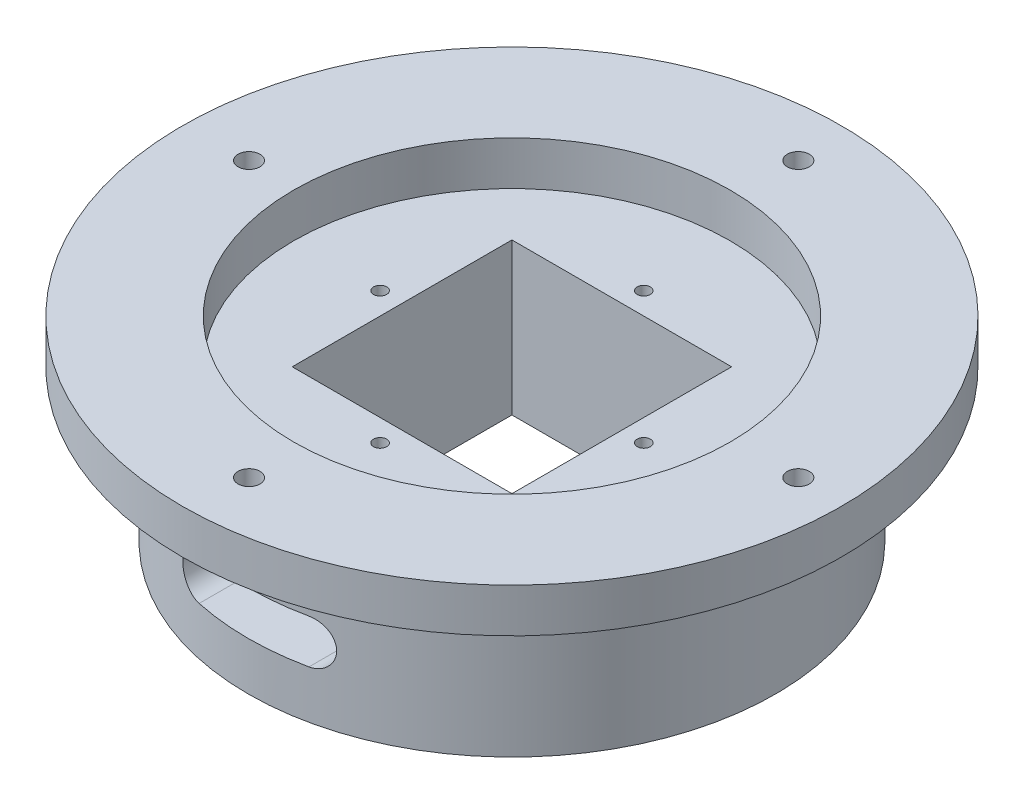
ISO-10303-21;
HEADER;
FILE_DESCRIPTION(('STEP AP214'),'2;1');
FILE_NAME('part.step','',(''),(''),'','','');
FILE_SCHEMA(('AUTOMOTIVE_DESIGN { 1 0 10303 214 1 1 1 1 }'));
ENDSEC;
DATA;
#1=APPLICATION_CONTEXT('core data for automotive mechanical design processes');
#2=APPLICATION_PROTOCOL_DEFINITION('international standard','automotive_design',2000,#1);
#3=PRODUCT_CONTEXT('',#1,'mechanical');
#4=PRODUCT('Part','Part','',(#3));
#5=PRODUCT_RELATED_PRODUCT_CATEGORY('part','',(#4));
#6=PRODUCT_DEFINITION_FORMATION('','',#4);
#7=PRODUCT_DEFINITION_CONTEXT('part definition',#1,'design');
#8=PRODUCT_DEFINITION('design','',#6,#7);
#9=PRODUCT_DEFINITION_SHAPE('','',#8);
#10=(LENGTH_UNIT() NAMED_UNIT(*) SI_UNIT(.MILLI.,.METRE.));
#11=(NAMED_UNIT(*) PLANE_ANGLE_UNIT() SI_UNIT($,.RADIAN.));
#12=(NAMED_UNIT(*) SI_UNIT($,.STERADIAN.) SOLID_ANGLE_UNIT());
#13=UNCERTAINTY_MEASURE_WITH_UNIT(LENGTH_MEASURE(1.E-05),#10,'distance_accuracy_value','');
#14=(GEOMETRIC_REPRESENTATION_CONTEXT(3) GLOBAL_UNCERTAINTY_ASSIGNED_CONTEXT((#13)) GLOBAL_UNIT_ASSIGNED_CONTEXT((#10,
#11,#12)) REPRESENTATION_CONTEXT('',''));
#15=CARTESIAN_POINT('',(0.,0.,0.));
#16=DIRECTION('',(0.,0.,1.));
#17=DIRECTION('',(1.,0.,0.));
#18=AXIS2_PLACEMENT_3D('',#15,#16,#17);
#19=CARTESIAN_POINT('',(-30.6560967692802,69.,61.474017121987));
#20=DIRECTION('',(0.,-1.,0.));
#21=DIRECTION('',(0.,0.,-1.));
#22=AXIS2_PLACEMENT_3D('',#19,#20,#21);
#23=CYLINDRICAL_SURFACE('',#22,3.);
#24=CARTESIAN_POINT('',(-30.6560967692802,21.8993662967322,61.474017121987));
#25=DIRECTION('',(0.,-1.,0.));
#26=DIRECTION('',(1.,0.,0.));
#27=AXIS2_PLACEMENT_3D('',#24,#25,#26);
#28=CIRCLE('',#27,3.);
#29=CARTESIAN_POINT('',(-27.6560967692802,21.8993662967322,61.474017121987));
#30=VERTEX_POINT('',#29);
#31=EDGE_CURVE('E140',#30,#30,#28,.T.);
#32=ORIENTED_EDGE('',*,*,#31,.F.);
#33=EDGE_LOOP('',(#32));
#34=FACE_BOUND('',#33,.T.);
#35=CARTESIAN_POINT('',(-30.6560967692802,0.,61.474017121987));
#36=DIRECTION('',(0.,1.,0.));
#37=DIRECTION('',(0.,0.,1.));
#38=AXIS2_PLACEMENT_3D('',#35,#36,#37);
#39=CIRCLE('',#38,3.);
#40=CARTESIAN_POINT('',(-30.6560967692802,0.,64.474017121987));
#41=VERTEX_POINT('',#40);
#42=EDGE_CURVE('E211',#41,#41,#39,.T.);
#43=ORIENTED_EDGE('',*,*,#42,.F.);
#44=EDGE_LOOP('',(#43));
#45=FACE_BOUND('',#44,.T.);
#46=ADVANCED_FACE('F39',(#34,#45),#23,.F.);
#47=CARTESIAN_POINT('',(0.,69.,0.));
#48=DIRECTION('',(0.,1.,0.));
#49=DIRECTION('',(0.,0.,1.));
#50=AXIS2_PLACEMENT_3D('',#47,#48,#49);
#51=PLANE('',#50);
#52=DIRECTION('',(1.,0.,0.));
#53=VECTOR('',#52,1.);
#54=CARTESIAN_POINT('',(0.,69.,-48.525982878013));
#55=LINE('',#54,#53);
#56=CARTESIAN_POINT('',(-80.6560967692802,69.,-48.525982878013));
#57=VERTEX_POINT('',#56);
#58=CARTESIAN_POINT('',(19.3439032307198,69.,-48.525982878013));
#59=VERTEX_POINT('',#58);
#60=EDGE_CURVE('E194',#57,#59,#55,.T.);
#61=ORIENTED_EDGE('',*,*,#60,.T.);
#62=DIRECTION('',(0.,0.,1.));
#63=VECTOR('',#62,1.);
#64=CARTESIAN_POINT('',(19.3439032307198,69.,0.));
#65=LINE('',#64,#63);
#66=CARTESIAN_POINT('',(19.3439032307198,69.,51.474017121987));
#67=VERTEX_POINT('',#66);
#68=EDGE_CURVE('E197',#59,#67,#65,.T.);
#69=ORIENTED_EDGE('',*,*,#68,.T.);
#70=DIRECTION('',(1.,0.,0.));
#71=VECTOR('',#70,1.);
#72=CARTESIAN_POINT('',(0.,69.,51.474017121987));
#73=LINE('',#72,#71);
#74=CARTESIAN_POINT('',(-80.6560967692802,69.,51.474017121987));
#75=VERTEX_POINT('',#74);
#76=EDGE_CURVE('E199',#75,#67,#73,.T.);
#77=ORIENTED_EDGE('',*,*,#76,.F.);
#78=DIRECTION('',(0.,0.,1.));
#79=VECTOR('',#78,1.);
#80=CARTESIAN_POINT('',(-80.6560967692802,69.,0.));
#81=LINE('',#80,#79);
#82=EDGE_CURVE('E202',#57,#75,#81,.T.);
#83=ORIENTED_EDGE('',*,*,#82,.F.);
#84=EDGE_LOOP('',(#61,#69,#77,#83));
#85=FACE_BOUND('',#84,.T.);
#86=CARTESIAN_POINT('',(-90.6560967692802,69.,1.47401712198698));
#87=DIRECTION('',(0.,1.,0.));
#88=DIRECTION('',(0.,0.,1.));
#89=AXIS2_PLACEMENT_3D('',#86,#87,#88);
#90=CIRCLE('',#89,3.00000000000001);
#91=CARTESIAN_POINT('',(-90.6560967692802,69.,4.47401712198698));
#92=VERTEX_POINT('',#91);
#93=EDGE_CURVE('E188',#92,#92,#90,.T.);
#94=ORIENTED_EDGE('',*,*,#93,.F.);
#95=EDGE_LOOP('',(#94));
#96=FACE_BOUND('',#95,.T.);
#97=CARTESIAN_POINT('',(-30.6560967692802,69.,61.474017121987));
#98=DIRECTION('',(0.,1.,0.));
#99=DIRECTION('',(0.,0.,1.));
#100=AXIS2_PLACEMENT_3D('',#97,#98,#99);
#101=CIRCLE('',#100,3.);
#102=CARTESIAN_POINT('',(-30.6560967692802,69.,64.474017121987));
#103=VERTEX_POINT('',#102);
#104=EDGE_CURVE('E185',#103,#103,#101,.T.);
#105=ORIENTED_EDGE('',*,*,#104,.F.);
#106=EDGE_LOOP('',(#105));
#107=FACE_BOUND('',#106,.T.);
#108=CARTESIAN_POINT('',(-30.6560967692802,69.,-58.525982878013));
#109=DIRECTION('',(0.,1.,0.));
#110=DIRECTION('',(0.,0.,1.));
#111=AXIS2_PLACEMENT_3D('',#108,#109,#110);
#112=CIRCLE('',#111,3.);
#113=CARTESIAN_POINT('',(-30.6560967692802,69.,-55.525982878013));
#114=VERTEX_POINT('',#113);
#115=EDGE_CURVE('E181',#114,#114,#112,.T.);
#116=ORIENTED_EDGE('',*,*,#115,.F.);
#117=EDGE_LOOP('',(#116));
#118=FACE_BOUND('',#117,.T.);
#119=CARTESIAN_POINT('',(29.3439032307198,69.,1.47401712198698));
#120=DIRECTION('',(0.,1.,0.));
#121=DIRECTION('',(0.,0.,1.));
#122=AXIS2_PLACEMENT_3D('',#119,#120,#121);
#123=CIRCLE('',#122,3.);
#124=CARTESIAN_POINT('',(29.3439032307198,69.,4.47401712198698));
#125=VERTEX_POINT('',#124);
#126=EDGE_CURVE('E178',#125,#125,#123,.T.);
#127=ORIENTED_EDGE('',*,*,#126,.F.);
#128=EDGE_LOOP('',(#127));
#129=FACE_BOUND('',#128,.T.);
#130=CARTESIAN_POINT('',(-30.6560967692802,69.,1.47401712198698));
#131=DIRECTION('',(0.,1.,0.));
#132=DIRECTION('',(0.,0.,1.));
#133=AXIS2_PLACEMENT_3D('',#130,#131,#132);
#134=CIRCLE('',#133,99.33727817983);
#135=CARTESIAN_POINT('',(-30.6560967692802,69.,100.811295301817));
#136=VERTEX_POINT('',#135);
#137=EDGE_CURVE('E239',#136,#136,#134,.F.);
#138=ORIENTED_EDGE('',*,*,#137,.F.);
#139=EDGE_LOOP('',(#138));
#140=FACE_BOUND('',#139,.T.);
#141=ADVANCED_FACE('F314',(#85,#96,#107,#118,#129,#140),#51,.T.);
#142=CARTESIAN_POINT('',(0.,69.,-48.525982878013));
#143=DIRECTION('',(0.,0.,-1.));
#144=DIRECTION('',(-1.,0.,0.));
#145=AXIS2_PLACEMENT_3D('',#142,#143,#144);
#146=PLANE('',#145);
#147=DIRECTION('',(1.,0.,0.));
#148=VECTOR('',#147,1.);
#149=CARTESIAN_POINT('',(0.,0.,-48.525982878013));
#150=LINE('',#149,#148);
#151=CARTESIAN_POINT('',(-80.6560967692802,0.,-48.525982878013));
#152=VERTEX_POINT('',#151);
#153=CARTESIAN_POINT('',(19.3439032307198,0.,-48.525982878013));
#154=VERTEX_POINT('',#153);
#155=EDGE_CURVE('E220',#152,#154,#150,.T.);
#156=ORIENTED_EDGE('',*,*,#155,.T.);
#157=DIRECTION('',(0.,-1.,0.));
#158=VECTOR('',#157,1.);
#159=CARTESIAN_POINT('',(19.3439032307198,69.,-48.525982878013));
#160=LINE('',#159,#158);
#161=EDGE_CURVE('E236',#59,#154,#160,.T.);
#162=ORIENTED_EDGE('',*,*,#161,.F.);
#163=ORIENTED_EDGE('',*,*,#60,.F.);
#164=DIRECTION('',(0.,-1.,0.));
#165=VECTOR('',#164,1.);
#166=CARTESIAN_POINT('',(-80.6560967692802,69.,-48.525982878013));
#167=LINE('',#166,#165);
#168=EDGE_CURVE('E205',#57,#152,#167,.T.);
#169=ORIENTED_EDGE('',*,*,#168,.T.);
#170=EDGE_LOOP('',(#156,#162,#163,#169));
#171=FACE_BOUND('',#170,.T.);
#172=ADVANCED_FACE('F317',(#171),#146,.F.);
#173=CARTESIAN_POINT('',(19.3439032307198,69.,0.));
#174=DIRECTION('',(1.,0.,0.));
#175=DIRECTION('',(0.,0.,-1.));
#176=AXIS2_PLACEMENT_3D('',#173,#174,#175);
#177=PLANE('',#176);
#178=DIRECTION('',(0.,0.,1.));
#179=VECTOR('',#178,1.);
#180=CARTESIAN_POINT('',(19.3439032307198,0.,0.));
#181=LINE('',#180,#179);
#182=CARTESIAN_POINT('',(19.3439032307198,0.,51.474017121987));
#183=VERTEX_POINT('',#182);
#184=EDGE_CURVE('E223',#154,#183,#181,.T.);
#185=ORIENTED_EDGE('',*,*,#184,.T.);
#186=DIRECTION('',(0.,-1.,0.));
#187=VECTOR('',#186,1.);
#188=CARTESIAN_POINT('',(19.3439032307198,69.,51.474017121987));
#189=LINE('',#188,#187);
#190=EDGE_CURVE('E234',#67,#183,#189,.T.);
#191=ORIENTED_EDGE('',*,*,#190,.F.);
#192=ORIENTED_EDGE('',*,*,#68,.F.);
#193=ORIENTED_EDGE('',*,*,#161,.T.);
#194=EDGE_LOOP('',(#185,#191,#192,#193));
#195=FACE_BOUND('',#194,.T.);
#196=ADVANCED_FACE('F328',(#195),#177,.F.);
#197=CARTESIAN_POINT('',(0.,69.,51.474017121987));
#198=DIRECTION('',(0.,0.,-1.));
#199=DIRECTION('',(-1.,0.,0.));
#200=AXIS2_PLACEMENT_3D('',#197,#198,#199);
#201=PLANE('',#200);
#202=CARTESIAN_POINT('',(-55.6560967692802,31.8993662967322,51.474017121987));
#203=DIRECTION('',(0.,0.,-1.));
#204=DIRECTION('',(-1.,0.,0.));
#205=AXIS2_PLACEMENT_3D('',#202,#203,#204);
#206=CIRCLE('',#205,9.99999999999999);
#207=CARTESIAN_POINT('',(-55.6560967692802,21.8993662967322,51.474017121987));
#208=VERTEX_POINT('',#207);
#209=CARTESIAN_POINT('',(-55.6560967692802,41.8993662967322,51.474017121987));
#210=VERTEX_POINT('',#209);
#211=EDGE_CURVE('E60',#208,#210,#206,.T.);
#212=ORIENTED_EDGE('',*,*,#211,.F.);
#213=DIRECTION('',(-1.,0.,0.));
#214=VECTOR('',#213,1.);
#215=CARTESIAN_POINT('',(-55.6560967692802,21.8993662967322,51.474017121987));
#216=LINE('',#215,#214);
#217=CARTESIAN_POINT('',(-5.65619666327777,21.8993662967322,51.474017121987));
#218=VERTEX_POINT('',#217);
#219=EDGE_CURVE('E128',#218,#208,#216,.T.);
#220=ORIENTED_EDGE('',*,*,#219,.F.);
#221=CARTESIAN_POINT('',(-5.65619666327777,31.8993662967322,51.474017121987));
#222=DIRECTION('',(0.,0.,-1.));
#223=DIRECTION('',(-1.,0.,0.));
#224=AXIS2_PLACEMENT_3D('',#221,#222,#223);
#225=CIRCLE('',#224,9.99999999999999);
#226=CARTESIAN_POINT('',(-5.65619666327777,41.8993662967322,51.474017121987));
#227=VERTEX_POINT('',#226);
#228=EDGE_CURVE('E113',#227,#218,#225,.T.);
#229=ORIENTED_EDGE('',*,*,#228,.F.);
#230=DIRECTION('',(1.,0.,0.));
#231=VECTOR('',#230,1.);
#232=CARTESIAN_POINT('',(-55.6560967692802,41.8993662967322,51.474017121987));
#233=LINE('',#232,#231);
#234=EDGE_CURVE('E121',#210,#227,#233,.T.);
#235=ORIENTED_EDGE('',*,*,#234,.F.);
#236=EDGE_LOOP('',(#212,#220,#229,#235));
#237=FACE_BOUND('',#236,.T.);
#238=DIRECTION('',(1.,0.,0.));
#239=VECTOR('',#238,1.);
#240=CARTESIAN_POINT('',(0.,0.,51.474017121987));
#241=LINE('',#240,#239);
#242=CARTESIAN_POINT('',(-80.6560967692802,0.,51.474017121987));
#243=VERTEX_POINT('',#242);
#244=EDGE_CURVE('E226',#243,#183,#241,.T.);
#245=ORIENTED_EDGE('',*,*,#244,.F.);
#246=DIRECTION('',(0.,-1.,0.));
#247=VECTOR('',#246,1.);
#248=CARTESIAN_POINT('',(-80.6560967692802,69.,51.474017121987));
#249=LINE('',#248,#247);
#250=EDGE_CURVE('E232',#75,#243,#249,.T.);
#251=ORIENTED_EDGE('',*,*,#250,.F.);
#252=ORIENTED_EDGE('',*,*,#76,.T.);
#253=ORIENTED_EDGE('',*,*,#190,.T.);
#254=EDGE_LOOP('',(#245,#251,#252,#253));
#255=FACE_BOUND('',#254,.T.);
#256=ADVANCED_FACE('F125',(#237,#255),#201,.T.);
#257=CARTESIAN_POINT('',(-30.6560967692802,69.,1.47401712198698));
#258=DIRECTION('',(0.,-1.,0.));
#259=DIRECTION('',(0.,0.,-1.));
#260=AXIS2_PLACEMENT_3D('',#257,#258,#259);
#261=CYLINDRICAL_SURFACE('',#260,120.);
#262=CARTESIAN_POINT('',(-30.6560967692802,21.8993662967322,1.47401712198698));
#263=DIRECTION('',(0.,-1.,0.));
#264=DIRECTION('',(1.,0.,0.));
#265=AXIS2_PLACEMENT_3D('',#262,#263,#264);
#266=CIRCLE('',#265,120.);
#267=CARTESIAN_POINT('',(-5.65619666327777,21.8993662967322,118.840984343134));
#268=VERTEX_POINT('',#267);
#269=CARTESIAN_POINT('',(-55.6560967692802,21.8993662967322,118.840963065042));
#270=VERTEX_POINT('',#269);
#271=EDGE_CURVE('E141',#268,#270,#266,.T.);
#272=ORIENTED_EDGE('',*,*,#271,.T.);
#273=CARTESIAN_POINT('',(-55.6560967692802,21.8993662967322,118.840963065042));
#274=CARTESIAN_POINT('',(-55.9447800015794,21.8993396281902,118.779482635862));
#275=CARTESIAN_POINT('',(-56.2332187693566,21.9118656376083,118.716918926815));
#276=CARTESIAN_POINT('',(-56.8075549357816,21.9617067146833,118.590143293644));
#277=CARTESIAN_POINT('',(-57.0934525697199,21.9990194625186,118.525931524305));
#278=CARTESIAN_POINT('',(-57.6605725500231,22.0980940262476,118.396397540875));
#279=CARTESIAN_POINT('',(-57.9417970765762,22.1598440873035,118.331075875104));
#280=CARTESIAN_POINT('',(-58.4977577795511,22.3073038344603,118.199864494647));
#281=CARTESIAN_POINT('',(-58.7724939212498,22.3930136487524,118.133974776924));
#282=CARTESIAN_POINT('',(-59.3136350237975,22.5878072881324,118.002224386443));
#283=CARTESIAN_POINT('',(-59.5800380147538,22.6968965928097,117.936363724128));
#284=CARTESIAN_POINT('',(-60.1025977443109,22.9377038432077,117.805337690982));
#285=CARTESIAN_POINT('',(-60.3587543069524,23.0694221773254,117.740172332105));
#286=CARTESIAN_POINT('',(-60.8589834895232,23.354610621085,117.611230579361));
#287=CARTESIAN_POINT('',(-61.1030576333196,23.5080779782023,117.547454010907));
#288=CARTESIAN_POINT('',(-61.5774051402999,23.8357934915934,117.421992027526));
#289=CARTESIAN_POINT('',(-61.8076785796895,24.0100415331032,117.360306601053));
#290=CARTESIAN_POINT('',(-62.2524930264922,24.3780111505835,117.239818607927));
#291=CARTESIAN_POINT('',(-62.4670502936197,24.5717120943418,117.181013083266));
#292=CARTESIAN_POINT('',(-62.8790502855517,24.9774782897764,117.066953605841));
#293=CARTESIAN_POINT('',(-63.0764938611294,25.1895426275042,117.011699476562));
#294=CARTESIAN_POINT('',(-63.452713873985,25.6306507976631,116.905469197397));
#295=CARTESIAN_POINT('',(-63.631489412642,25.8596954465667,116.854493253472));
#296=CARTESIAN_POINT('',(-63.9688660371863,26.3331859694662,116.757538160469));
#297=CARTESIAN_POINT('',(-64.1274676819418,26.5776314165403,116.711558872976));
#298=CARTESIAN_POINT('',(-64.4190874277434,27.0733504942292,116.626450502282));
#299=CARTESIAN_POINT('',(-64.5526838456489,27.324257803681,116.587169166164));
#300=CARTESIAN_POINT('',(-64.7983096988317,27.8372475526085,116.51455654018));
#301=CARTESIAN_POINT('',(-64.910339451668,28.0993298274688,116.481225162705));
#302=CARTESIAN_POINT('',(-65.1117858855593,28.6326883883606,116.421033378666));
#303=CARTESIAN_POINT('',(-65.2012086286786,28.9039621875139,116.39417123747));
#304=CARTESIAN_POINT('',(-65.3566326316257,29.453718690425,116.34733608962));
#305=CARTESIAN_POINT('',(-65.4226346297823,29.7322011666352,116.327362865796));
#306=CARTESIAN_POINT('',(-65.5284349586385,30.2830574038422,116.295282399363));
#307=CARTESIAN_POINT('',(-65.5691685008332,30.5552355673586,116.282894671162));
#308=CARTESIAN_POINT('',(-65.6280705325789,31.1022437323558,116.264966263044));
#309=CARTESIAN_POINT('',(-65.6462396612338,31.3770736585071,116.2594253892));
#310=CARTESIAN_POINT('',(-65.6598435537618,31.9273153225644,116.25527762));
#311=CARTESIAN_POINT('',(-65.6552809379798,32.2027269897532,116.256669925439));
#312=CARTESIAN_POINT('',(-65.6234699999719,32.7521135644313,116.266364799168));
#313=CARTESIAN_POINT('',(-65.5962218389448,33.0260884821159,116.274667318355));
#314=CARTESIAN_POINT('',(-65.5201227341005,33.5647108360612,116.297800511205));
#315=CARTESIAN_POINT('',(-65.4717492552519,33.8294321240456,116.312486867854));
#316=CARTESIAN_POINT('',(-65.3539510711577,34.3537106738368,116.348133827228));
#317=CARTESIAN_POINT('',(-65.2845267641057,34.6132680332245,116.369094311273));
#318=CARTESIAN_POINT('',(-65.125217371741,35.1254612929868,116.416988353646));
#319=CARTESIAN_POINT('',(-65.0353318334324,35.3780970399835,116.443922044215));
#320=CARTESIAN_POINT('',(-64.835842726376,35.8747769160433,116.503386375417));
#321=CARTESIAN_POINT('',(-64.7262388265928,36.1188209007841,116.535917110015));
#322=CARTESIAN_POINT('',(-64.4865862190323,36.599967997945,116.606609343247));
#323=CARTESIAN_POINT('',(-64.3562828451307,36.8369339846129,116.644840557871));
#324=CARTESIAN_POINT('',(-64.0772909410883,37.2990293031471,116.726109893783));
#325=CARTESIAN_POINT('',(-63.9285957313515,37.5241542920119,116.769149760939));
#326=CARTESIAN_POINT('',(-63.6139898190157,37.9610822758911,116.859475721824));
#327=CARTESIAN_POINT('',(-63.4480812311172,38.1728869022179,116.906761293864));
#328=CARTESIAN_POINT('',(-63.1002133208704,38.5819726553262,117.005017127788));
#329=CARTESIAN_POINT('',(-62.9182530752277,38.7792529454662,117.055987601597));
#330=CARTESIAN_POINT('',(-62.5325572207623,39.1651366910612,117.162965462358));
#331=CARTESIAN_POINT('',(-62.3282665839145,39.3531533627085,117.219089198707));
#332=CARTESIAN_POINT('',(-61.9052197403998,39.7112332535957,117.334020365672));
#333=CARTESIAN_POINT('',(-61.6864632135215,39.8812960751996,117.392827855687));
#334=CARTESIAN_POINT('',(-61.2358695120488,40.202542231008,117.512510108967));
#335=CARTESIAN_POINT('',(-61.0040260443978,40.3537163680668,117.57338586109));
#336=CARTESIAN_POINT('',(-60.5288969614164,40.6361967886175,117.696545203727));
#337=CARTESIAN_POINT('',(-60.2856113136995,40.7675030158699,117.758828798225));
#338=CARTESIAN_POINT('',(-59.780637962665,41.0136264697052,117.886349843128));
#339=CARTESIAN_POINT('',(-59.5186051692103,41.1277217958464,117.951615238923));
#340=CARTESIAN_POINT('',(-58.9858785361321,41.3330300390394,118.082330088268));
#341=CARTESIAN_POINT('',(-58.715187716732,41.424250839454,118.147779470523));
#342=CARTESIAN_POINT('',(-58.1672102901161,41.5831470452101,118.278203144775));
#343=CARTESIAN_POINT('',(-57.8899311404574,41.6508478329123,118.343177874382));
#344=CARTESIAN_POINT('',(-57.3304939764186,41.7623112362124,118.472131908834));
#345=CARTESIAN_POINT('',(-57.0483384056829,41.8060855023376,118.53611168338));
#346=CARTESIAN_POINT('',(-56.5806950435025,41.8582526023575,118.640355183729));
#347=CARTESIAN_POINT('',(-56.3960600408767,41.8736722616354,118.681056411216));
#348=CARTESIAN_POINT('',(-56.0263533717192,41.8942218540471,118.761637525151));
#349=CARTESIAN_POINT('',(-55.8412828923095,41.8993683682432,118.801518632133));
#350=CARTESIAN_POINT('',(-55.6560967692802,41.8993662967322,118.840963065042));
#351=B_SPLINE_CURVE_WITH_KNOTS('',3,(#273,#274,#275,#276,#277,#278,#279,#280,#281,#282,#283,
#284,#285,#286,#287,#288,#289,#290,#291,#292,#293,#294,#295,#296,#297,#298,#299,#300,#301,#302,
#303,#304,#305,#306,#307,#308,#309,#310,#311,#312,#313,#314,#315,#316,#317,#318,#319,#320,#321,
#322,#323,#324,#325,#326,#327,#328,#329,#330,#331,#332,#333,#334,#335,#336,#337,#338,#339,#340,
#341,#342,#343,#344,#345,#346,#347,#348,#349,#350),.UNSPECIFIED.,.F.,.F.,(4,2,2,2,2,2,2,2,2,2,2,
2,2,2,2,2,2,2,2,2,2,2,2,2,2,2,2,2,2,2,2,2,2,2,2,2,2,2,4),(0.,0.885185155359751,1.77028747681313,
2.65496456278422,3.53964638210691,4.42453577674423,5.30944036084208,6.19423305255582,
7.07902085811487,7.96287995345002,8.84669508425896,9.73055273957238,10.6143859044516,
11.4741900489593,12.333981532291,13.1935422176141,14.0530758032539,14.8785289106434,
15.7039586377533,16.5292932177213,17.3546219330844,18.1621912350344,18.9697452621083,
19.777317169546,20.5849026359187,21.4033275634807,22.2220506064063,23.0406731862743,
23.8593428842089,24.7081506169768,25.5569771449241,26.4062153800897,27.2554560191209,
28.1338871174832,29.0120150603558,29.8891923784457,30.7659421917189,31.334768501888,
31.9026759702232),.UNSPECIFIED.);
#352=CARTESIAN_POINT('',(-55.6560967692802,41.8993662967322,118.840963065042));
#353=VERTEX_POINT('',#352);
#354=EDGE_CURVE('E11',#270,#353,#351,.T.);
#355=ORIENTED_EDGE('',*,*,#354,.T.);
#356=CARTESIAN_POINT('',(-30.6560967692802,41.8993662967322,1.47401712198698));
#357=DIRECTION('',(0.,1.,0.));
#358=DIRECTION('',(0.,0.,1.));
#359=AXIS2_PLACEMENT_3D('',#356,#357,#358);
#360=CIRCLE('',#359,120.);
#361=CARTESIAN_POINT('',(-5.65619666327777,41.8993662967322,118.840984343134));
#362=VERTEX_POINT('',#361);
#363=EDGE_CURVE('E138',#353,#362,#360,.T.);
#364=ORIENTED_EDGE('',*,*,#363,.T.);
#365=CARTESIAN_POINT('',(-5.65619666327777,41.8993662967322,118.840984343134));
#366=CARTESIAN_POINT('',(-5.3675134846331,41.8993929653078,118.779504182228));
#367=CARTESIAN_POINT('',(-5.07907476938728,41.8868669605033,118.716940742035));
#368=CARTESIAN_POINT('',(-4.50473870555798,41.8370259014586,118.590165645791));
#369=CARTESIAN_POINT('',(-4.21884112168412,41.7997131670397,118.525954144525));
#370=CARTESIAN_POINT('',(-3.65172123994061,41.7006386387809,118.396420694696));
#371=CARTESIAN_POINT('',(-3.37049676186575,41.6388885998733,118.331099294458));
#372=CARTESIAN_POINT('',(-2.81453615296406,41.4914289055501,118.199888440489));
#373=CARTESIAN_POINT('',(-2.53980005686012,41.4057191219443,118.133998983722));
#374=CARTESIAN_POINT('',(-1.99865904243445,41.210925552589,118.002249108709));
#375=CARTESIAN_POINT('',(-1.73225609400337,41.1018362872555,117.936388700905));
#376=CARTESIAN_POINT('',(-1.20969644599616,40.8610291244518,117.805363168293));
#377=CARTESIAN_POINT('',(-0.953539922380032,40.729310838583,117.740198055441));
#378=CARTESIAN_POINT('',(-0.453310813727186,40.4441225005801,117.611256784177));
#379=CARTESIAN_POINT('',(-0.209236704827462,40.290655200963,117.547480451181));
#380=CARTESIAN_POINT('',(0.265110737263208,39.9629398123004,117.42201892609));
#381=CARTESIAN_POINT('',(0.495384146658991,39.7886918380178,117.360333722449));
#382=CARTESIAN_POINT('',(0.94019855187831,39.4207223548385,117.239846156599));
#383=CARTESIAN_POINT('',(1.15475580655401,39.2270214770577,117.181040836553));
#384=CARTESIAN_POINT('',(1.56675577920231,38.8212554218447,117.066981751693));
#385=CARTESIAN_POINT('',(1.76419934794372,38.6091911583564,117.011727810365));
#386=CARTESIAN_POINT('',(2.1404193544244,38.1680831448975,116.905497888188));
#387=CARTESIAN_POINT('',(2.319194893527,37.9390385784403,116.854522113304));
#388=CARTESIAN_POINT('',(2.65657152792609,37.4655482284683,116.757567337243));
#389=CARTESIAN_POINT('',(2.81517318208585,37.2211028718716,116.711588197653));
#390=CARTESIAN_POINT('',(3.106792988713,36.7253839262106,116.626480086525));
#391=CARTESIAN_POINT('',(3.24038945328041,36.4744766552903,116.587198863869));
#392=CARTESIAN_POINT('',(3.4860154022913,35.9614869843294,116.514586443526));
#393=CARTESIAN_POINT('',(3.5980452042909,35.6994047489029,116.481255158228));
#394=CARTESIAN_POINT('',(3.79949174021826,35.1660462666962,116.421063535805));
#395=CARTESIAN_POINT('',(3.88891453617667,34.8947725067804,116.394201464062));
#396=CARTESIAN_POINT('',(4.04433864922759,34.3450160813583,116.347366431325));
#397=CARTESIAN_POINT('',(4.11034070464396,34.0665336433979,116.327393253164));
#398=CARTESIAN_POINT('',(4.21614116359994,33.5156774112076,116.295312848214));
#399=CARTESIAN_POINT('',(4.25687477289565,33.2434992133994,116.282925138451));
#400=CARTESIAN_POINT('',(4.31577693223774,32.6964909750367,116.264996747628));
#401=CARTESIAN_POINT('',(4.33394612138402,32.4216610098113,116.259455872642));
#402=CARTESIAN_POINT('',(4.34755012795305,31.871419262507,116.255308081618));
#403=CARTESIAN_POINT('',(4.34298756570685,31.5960075511454,116.256700366381));
#404=CARTESIAN_POINT('',(4.31117672724372,31.0466208830964,116.266395179551));
#405=CARTESIAN_POINT('',(4.28392861222516,30.7726459162138,116.274697658855));
#406=CARTESIAN_POINT('',(4.20782958628671,30.2340234323023,116.297830755569));
#407=CARTESIAN_POINT('',(4.15945613828092,29.9693020640013,116.312517057035));
#408=CARTESIAN_POINT('',(4.04165800275359,29.4450233503398,116.348163890259));
#409=CARTESIAN_POINT('',(3.97223371342379,29.185465907399,116.369124303336));
#410=CARTESIAN_POINT('',(3.81292434271271,28.6732724784598,116.417018188796));
#411=CARTESIAN_POINT('',(3.72303880833885,28.4206366458381,116.443951793418));
#412=CARTESIAN_POINT('',(3.52354969476163,27.9239565978016,116.503415938645));
#413=CARTESIAN_POINT('',(3.41394578452429,27.6799125267082,116.535946573214));
#414=CARTESIAN_POINT('',(3.17429315197278,27.1987652786062,116.606638588565));
#415=CARTESIAN_POINT('',(3.04398976509423,26.9617992264142,116.644869684679));
#416=CARTESIAN_POINT('',(2.76499782289952,26.4997037773145,116.726138770155));
#417=CARTESIAN_POINT('',(2.6163025879826,26.2745787234089,116.769178505381));
#418=CARTESIAN_POINT('',(2.30169661296626,25.8376506118256,116.859504190089));
#419=CARTESIAN_POINT('',(2.13578798757799,25.6258459228284,116.906789617881));
#420=CARTESIAN_POINT('',(1.7879199900869,25.2167600485223,117.005045152001));
#421=CARTESIAN_POINT('',(1.60595969469213,25.0194796998523,117.056015470252));
#422=CARTESIAN_POINT('',(1.22026376777824,24.6335958821681,117.162992992269));
#423=CARTESIAN_POINT('',(1.01597311110756,24.4455791936837,117.219116544346));
#424=CARTESIAN_POINT('',(0.592926221853263,24.0874992700899,117.334047331626));
#425=CARTESIAN_POINT('',(0.374169669059935,23.9174364326143,117.392854626225));
#426=CARTESIAN_POINT('',(-0.0764240898129973,23.5961902476259,117.512536478683));
#427=CARTESIAN_POINT('',(-0.308267588940487,23.4450160972429,117.573412025394));
#428=CARTESIAN_POINT('',(-0.783396739912106,23.1625356538381,117.696570948582));
#429=CARTESIAN_POINT('',(-1.02668242414068,23.0312294170521,117.758854329045));
#430=CARTESIAN_POINT('',(-1.53165579814229,22.7851059759225,117.88637491695));
#431=CARTESIAN_POINT('',(-1.7936885759142,22.6710106674276,117.951640069339));
#432=CARTESIAN_POINT('',(-2.32641517718932,22.4657024559479,118.082354425327));
#433=CARTESIAN_POINT('',(-2.59710598046716,22.3744816695958,118.147803557636));
#434=CARTESIAN_POINT('',(-3.14508337397737,22.2155854887858,118.278226727308));
#435=CARTESIAN_POINT('',(-3.42236250665099,22.1478847119617,118.343201202288));
#436=CARTESIAN_POINT('',(-3.98179963548346,22.0364213273579,118.472154724324));
#437=CARTESIAN_POINT('',(-4.26395518799815,21.9926470690506,118.536134241082));
#438=CARTESIAN_POINT('',(-4.731598508284,21.9404799804693,118.640377312834));
#439=CARTESIAN_POINT('',(-4.91623348766491,21.9250603251514,118.681078369983));
#440=CARTESIAN_POINT('',(-5.28594010947611,21.9045107380545,118.761659143407));
#441=CARTESIAN_POINT('',(-5.47101056478563,21.8993642252161,118.801540080219));
#442=CARTESIAN_POINT('',(-5.65619666327777,21.8993662967322,118.840984343134));
#443=B_SPLINE_CURVE_WITH_KNOTS('',3,(#365,#366,#367,#368,#369,#370,#371,#372,#373,#374,#375,
#376,#377,#378,#379,#380,#381,#382,#383,#384,#385,#386,#387,#388,#389,#390,#391,#392,#393,#394,
#395,#396,#397,#398,#399,#400,#401,#402,#403,#404,#405,#406,#407,#408,#409,#410,#411,#412,#413,
#414,#415,#416,#417,#418,#419,#420,#421,#422,#423,#424,#425,#426,#427,#428,#429,#430,#431,#432,
#433,#434,#435,#436,#437,#438,#439,#440,#441,#442),.UNSPECIFIED.,.F.,.F.,(4,2,2,2,2,2,2,2,2,2,2,
2,2,2,2,2,2,2,2,2,2,2,2,2,2,2,2,2,2,2,2,2,2,2,2,2,2,2,4),(0.,0.885184830430204,1.77028682696932,
2.65496358461933,3.53964507558843,4.42453414165942,5.30943839725123,6.19423076076265,
7.07901823816867,7.96287705459596,8.84669190671851,9.73054928409239,10.6143821712377,
11.4741862336956,12.3339776350874,13.1935382397355,14.0530717448778,14.8785249811822,
15.7039548373548,16.5292895469014,17.3546183918571,18.1621879045151,18.9697421423703,
19.7773142604496,20.584899937392,21.4033250039278,22.2220481858911,23.04067090435,
23.8593407407233,24.7081484401571,25.5569749346597,26.4062131356089,27.2554537402744,
28.1338846135053,29.0120123311074,29.889189423833,30.765939011786,31.3347651435255,
31.9026724336472),.UNSPECIFIED.);
#444=EDGE_CURVE('E53',#362,#268,#443,.T.);
#445=ORIENTED_EDGE('',*,*,#444,.T.);
#446=EDGE_LOOP('',(#272,#355,#364,#445));
#447=FACE_BOUND('',#446,.T.);
#448=CARTESIAN_POINT('',(-30.6560967692802,69.,1.47401712198698));
#449=DIRECTION('',(0.,1.,0.));
#450=DIRECTION('',(0.,0.,1.));
#451=AXIS2_PLACEMENT_3D('',#448,#449,#450);
#452=CIRCLE('',#451,120.);
#453=CARTESIAN_POINT('',(-30.6560967692802,69.,121.474017121987));
#454=VERTEX_POINT('',#453);
#455=EDGE_CURVE('E191',#454,#454,#452,.T.);
#456=ORIENTED_EDGE('',*,*,#455,.F.);
#457=EDGE_LOOP('',(#456));
#458=FACE_BOUND('',#457,.T.);
#459=CARTESIAN_POINT('',(-30.6560967692802,0.,1.47401712198698));
#460=DIRECTION('',(0.,1.,0.));
#461=DIRECTION('',(0.,0.,1.));
#462=AXIS2_PLACEMENT_3D('',#459,#460,#461);
#463=CIRCLE('',#462,120.);
#464=CARTESIAN_POINT('',(-30.6560967692802,0.,121.474017121987));
#465=VERTEX_POINT('',#464);
#466=EDGE_CURVE('E217',#465,#465,#463,.T.);
#467=ORIENTED_EDGE('',*,*,#466,.T.);
#468=EDGE_LOOP('',(#467));
#469=FACE_BOUND('',#468,.T.);
#470=ADVANCED_FACE('F250',(#447,#458,#469),#261,.T.);
#471=CARTESIAN_POINT('',(-90.6560967692802,69.,1.47401712198698));
#472=DIRECTION('',(0.,-1.,0.));
#473=DIRECTION('',(0.,0.,-1.));
#474=AXIS2_PLACEMENT_3D('',#471,#472,#473);
#475=CYLINDRICAL_SURFACE('',#474,3.00000000000001);
#476=ORIENTED_EDGE('',*,*,#93,.T.);
#477=EDGE_LOOP('',(#476));
#478=FACE_BOUND('',#477,.T.);
#479=CARTESIAN_POINT('',(-90.6560967692802,0.,1.47401712198698));
#480=DIRECTION('',(0.,1.,0.));
#481=DIRECTION('',(0.,0.,1.));
#482=AXIS2_PLACEMENT_3D('',#479,#480,#481);
#483=CIRCLE('',#482,3.00000000000001);
#484=CARTESIAN_POINT('',(-90.6560967692802,0.,4.47401712198698));
#485=VERTEX_POINT('',#484);
#486=EDGE_CURVE('E214',#485,#485,#483,.T.);
#487=ORIENTED_EDGE('',*,*,#486,.F.);
#488=EDGE_LOOP('',(#487));
#489=FACE_BOUND('',#488,.T.);
#490=ADVANCED_FACE('F346',(#478,#489),#475,.F.);
#491=CARTESIAN_POINT('',(-30.6560967692802,41.8993662967322,61.474017121987));
#492=DIRECTION('',(0.,1.,0.));
#493=DIRECTION('',(0.,0.,1.));
#494=AXIS2_PLACEMENT_3D('',#491,#492,#493);
#495=CIRCLE('',#494,3.);
#496=CARTESIAN_POINT('',(-30.6560967692802,41.8993662967322,64.474017121987));
#497=VERTEX_POINT('',#496);
#498=EDGE_CURVE('E135',#497,#497,#495,.T.);
#499=ORIENTED_EDGE('',*,*,#498,.F.);
#500=EDGE_LOOP('',(#499));
#501=FACE_BOUND('',#500,.T.);
#502=ORIENTED_EDGE('',*,*,#104,.T.);
#503=EDGE_LOOP('',(#502));
#504=FACE_BOUND('',#503,.T.);
#505=ADVANCED_FACE('F338',(#501,#504),#23,.F.);
#506=CARTESIAN_POINT('',(-30.6560967692802,69.,-58.525982878013));
#507=DIRECTION('',(0.,-1.,0.));
#508=DIRECTION('',(0.,0.,-1.));
#509=AXIS2_PLACEMENT_3D('',#506,#507,#508);
#510=CYLINDRICAL_SURFACE('',#509,3.);
#511=ORIENTED_EDGE('',*,*,#115,.T.);
#512=EDGE_LOOP('',(#511));
#513=FACE_BOUND('',#512,.T.);
#514=CARTESIAN_POINT('',(-30.6560967692802,0.,-58.525982878013));
#515=DIRECTION('',(0.,1.,0.));
#516=DIRECTION('',(0.,0.,1.));
#517=AXIS2_PLACEMENT_3D('',#514,#515,#516);
#518=CIRCLE('',#517,3.);
#519=CARTESIAN_POINT('',(-30.6560967692802,0.,-55.525982878013));
#520=VERTEX_POINT('',#519);
#521=EDGE_CURVE('E208',#520,#520,#518,.T.);
#522=ORIENTED_EDGE('',*,*,#521,.F.);
#523=EDGE_LOOP('',(#522));
#524=FACE_BOUND('',#523,.T.);
#525=ADVANCED_FACE('F345',(#513,#524),#510,.F.);
#526=CARTESIAN_POINT('',(29.3439032307198,69.,1.47401712198698));
#527=DIRECTION('',(0.,-1.,0.));
#528=DIRECTION('',(0.,0.,-1.));
#529=AXIS2_PLACEMENT_3D('',#526,#527,#528);
#530=CYLINDRICAL_SURFACE('',#529,3.);
#531=ORIENTED_EDGE('',*,*,#126,.T.);
#532=EDGE_LOOP('',(#531));
#533=FACE_BOUND('',#532,.T.);
#534=CARTESIAN_POINT('',(29.3439032307198,0.,1.47401712198698));
#535=DIRECTION('',(0.,1.,0.));
#536=DIRECTION('',(0.,0.,1.));
#537=AXIS2_PLACEMENT_3D('',#534,#535,#536);
#538=CIRCLE('',#537,3.);
#539=CARTESIAN_POINT('',(29.3439032307198,0.,4.47401712198698));
#540=VERTEX_POINT('',#539);
#541=EDGE_CURVE('E175',#540,#540,#538,.T.);
#542=ORIENTED_EDGE('',*,*,#541,.F.);
#543=EDGE_LOOP('',(#542));
#544=FACE_BOUND('',#543,.T.);
#545=ADVANCED_FACE('F41',(#533,#544),#530,.F.);
#546=CARTESIAN_POINT('',(-80.6560967692802,69.,0.));
#547=DIRECTION('',(1.,0.,0.));
#548=DIRECTION('',(0.,0.,-1.));
#549=AXIS2_PLACEMENT_3D('',#546,#547,#548);
#550=PLANE('',#549);
#551=DIRECTION('',(0.,0.,1.));
#552=VECTOR('',#551,1.);
#553=CARTESIAN_POINT('',(-80.6560967692802,0.,0.));
#554=LINE('',#553,#552);
#555=EDGE_CURVE('E182',#152,#243,#554,.T.);
#556=ORIENTED_EDGE('',*,*,#555,.F.);
#557=ORIENTED_EDGE('',*,*,#168,.F.);
#558=ORIENTED_EDGE('',*,*,#82,.T.);
#559=ORIENTED_EDGE('',*,*,#250,.T.);
#560=EDGE_LOOP('',(#556,#557,#558,#559));
#561=FACE_BOUND('',#560,.T.);
#562=ADVANCED_FACE('F321',(#561),#550,.T.);
#563=CARTESIAN_POINT('',(0.,0.,0.));
#564=DIRECTION('',(0.,1.,0.));
#565=DIRECTION('',(0.,0.,1.));
#566=AXIS2_PLACEMENT_3D('',#563,#564,#565);
#567=PLANE('',#566);
#568=ORIENTED_EDGE('',*,*,#541,.T.);
#569=EDGE_LOOP('',(#568));
#570=FACE_BOUND('',#569,.T.);
#571=ORIENTED_EDGE('',*,*,#521,.T.);
#572=EDGE_LOOP('',(#571));
#573=FACE_BOUND('',#572,.T.);
#574=ORIENTED_EDGE('',*,*,#42,.T.);
#575=EDGE_LOOP('',(#574));
#576=FACE_BOUND('',#575,.T.);
#577=ORIENTED_EDGE('',*,*,#486,.T.);
#578=EDGE_LOOP('',(#577));
#579=FACE_BOUND('',#578,.T.);
#580=ORIENTED_EDGE('',*,*,#466,.F.);
#581=EDGE_LOOP('',(#580));
#582=FACE_BOUND('',#581,.T.);
#583=ORIENTED_EDGE('',*,*,#155,.F.);
#584=ORIENTED_EDGE('',*,*,#555,.T.);
#585=ORIENTED_EDGE('',*,*,#244,.T.);
#586=ORIENTED_EDGE('',*,*,#184,.F.);
#587=EDGE_LOOP('',(#583,#584,#585,#586));
#588=FACE_BOUND('',#587,.T.);
#589=ADVANCED_FACE('F306',(#570,#573,#576,#579,#582,#588),#567,.F.);
#590=CARTESIAN_POINT('',(-30.6560967692802,89.0000000000001,1.47401712198698));
#591=DIRECTION('',(0.,1.,0.));
#592=DIRECTION('',(0.,0.,1.));
#593=AXIS2_PLACEMENT_3D('',#590,#591,#592);
#594=PLANE('',#593);
#595=CARTESIAN_POINT('',(-151.787702045844,89.0000000000001,4.40619762898109E-13));
#596=DIRECTION('',(0.,1.,0.));
#597=DIRECTION('',(0.,0.,1.));
#598=AXIS2_PLACEMENT_3D('',#595,#596,#597);
#599=CIRCLE('',#598,5.);
#600=CARTESIAN_POINT('',(-151.787702045844,89.0000000000001,5.00000000000044));
#601=VERTEX_POINT('',#600);
#602=EDGE_CURVE('E149',#601,#601,#599,.T.);
#603=ORIENTED_EDGE('',*,*,#602,.F.);
#604=EDGE_LOOP('',(#603));
#605=FACE_BOUND('',#604,.T.);
#606=CARTESIAN_POINT('',(-26.7877020458459,89.0000000000001,-125.));
#607=DIRECTION('',(0.,1.,0.));
#608=DIRECTION('',(0.,0.,1.));
#609=AXIS2_PLACEMENT_3D('',#606,#607,#608);
#610=CIRCLE('',#609,5.);
#611=CARTESIAN_POINT('',(-26.7877020458459,89.0000000000001,-120.));
#612=VERTEX_POINT('',#611);
#613=EDGE_CURVE('E152',#612,#612,#610,.T.);
#614=ORIENTED_EDGE('',*,*,#613,.F.);
#615=EDGE_LOOP('',(#614));
#616=FACE_BOUND('',#615,.T.);
#617=CARTESIAN_POINT('',(98.2122979541559,89.0000000000001,-1.32532873564628E-12));
#618=DIRECTION('',(0.,1.,0.));
#619=DIRECTION('',(0.,0.,1.));
#620=AXIS2_PLACEMENT_3D('',#617,#618,#619);
#621=CIRCLE('',#620,5.00000000000001);
#622=CARTESIAN_POINT('',(98.2122979541559,89.0000000000001,4.99999999999868));
#623=VERTEX_POINT('',#622);
#624=EDGE_CURVE('E158',#623,#623,#621,.T.);
#625=ORIENTED_EDGE('',*,*,#624,.F.);
#626=EDGE_LOOP('',(#625));
#627=FACE_BOUND('',#626,.T.);
#628=CARTESIAN_POINT('',(-26.7877020458432,89.0000000000001,125.));
#629=DIRECTION('',(0.,1.,0.));
#630=DIRECTION('',(0.,0.,1.));
#631=AXIS2_PLACEMENT_3D('',#628,#629,#630);
#632=CIRCLE('',#631,5.);
#633=CARTESIAN_POINT('',(-26.7877020458432,89.0000000000001,130.));
#634=VERTEX_POINT('',#633);
#635=EDGE_CURVE('E164',#634,#634,#632,.T.);
#636=ORIENTED_EDGE('',*,*,#635,.F.);
#637=EDGE_LOOP('',(#636));
#638=FACE_BOUND('',#637,.T.);
#639=CARTESIAN_POINT('',(-30.6560967692802,89.0000000000001,1.47401712198698));
#640=DIRECTION('',(0.,1.,0.));
#641=DIRECTION('',(0.,0.,1.));
#642=AXIS2_PLACEMENT_3D('',#639,#640,#641);
#643=CIRCLE('',#642,150.);
#644=CARTESIAN_POINT('',(-30.6560967692802,89.0000000000001,151.474017121987));
#645=VERTEX_POINT('',#644);
#646=EDGE_CURVE('E172',#645,#645,#643,.T.);
#647=ORIENTED_EDGE('',*,*,#646,.T.);
#648=EDGE_LOOP('',(#647));
#649=FACE_BOUND('',#648,.T.);
#650=CARTESIAN_POINT('',(-30.6560967692802,89.0000000000001,1.47401712198698));
#651=DIRECTION('',(0.,1.,0.));
#652=DIRECTION('',(0.,0.,1.));
#653=AXIS2_PLACEMENT_3D('',#650,#651,#652);
#654=CIRCLE('',#653,99.33727817983);
#655=CARTESIAN_POINT('',(-30.6560967692802,89.0000000000001,100.811295301817));
#656=VERTEX_POINT('',#655);
#657=EDGE_CURVE('E148',#656,#656,#654,.T.);
#658=ORIENTED_EDGE('',*,*,#657,.F.);
#659=EDGE_LOOP('',(#658));
#660=FACE_BOUND('',#659,.T.);
#661=ADVANCED_FACE('F302',(#605,#616,#627,#638,#649,#660),#594,.T.);
#662=CARTESIAN_POINT('',(-30.6560967692802,69.,1.47401712198698));
#663=DIRECTION('',(0.,1.,0.));
#664=DIRECTION('',(0.,0.,1.));
#665=AXIS2_PLACEMENT_3D('',#662,#663,#664);
#666=PLANE('',#665);
#667=ORIENTED_EDGE('',*,*,#455,.T.);
#668=EDGE_LOOP('',(#667));
#669=FACE_BOUND('',#668,.T.);
#670=CARTESIAN_POINT('',(-30.6560967692802,69.,1.47401712198698));
#671=DIRECTION('',(0.,1.,0.));
#672=DIRECTION('',(0.,0.,1.));
#673=AXIS2_PLACEMENT_3D('',#670,#671,#672);
#674=CIRCLE('',#673,150.);
#675=CARTESIAN_POINT('',(-30.6560967692802,69.,151.474017121987));
#676=VERTEX_POINT('',#675);
#677=EDGE_CURVE('E171',#676,#676,#674,.T.);
#678=ORIENTED_EDGE('',*,*,#677,.F.);
#679=EDGE_LOOP('',(#678));
#680=FACE_BOUND('',#679,.T.);
#681=ADVANCED_FACE('F305',(#669,#680),#666,.F.);
#682=CARTESIAN_POINT('',(-30.6560967692802,89.0000000000001,1.47401712198698));
#683=DIRECTION('',(0.,-1.,0.));
#684=DIRECTION('',(0.,0.,-1.));
#685=AXIS2_PLACEMENT_3D('',#682,#683,#684);
#686=CYLINDRICAL_SURFACE('',#685,150.);
#687=ORIENTED_EDGE('',*,*,#646,.F.);
#688=EDGE_LOOP('',(#687));
#689=FACE_BOUND('',#688,.T.);
#690=ORIENTED_EDGE('',*,*,#677,.T.);
#691=EDGE_LOOP('',(#690));
#692=FACE_BOUND('',#691,.T.);
#693=ADVANCED_FACE('F300',(#689,#692),#686,.T.);
#694=CARTESIAN_POINT('',(-30.6560967692802,89.0000000000001,1.47401712198698));
#695=DIRECTION('',(0.,-1.,0.));
#696=DIRECTION('',(0.,0.,-1.));
#697=AXIS2_PLACEMENT_3D('',#694,#695,#696);
#698=CYLINDRICAL_SURFACE('',#697,99.33727817983);
#699=ORIENTED_EDGE('',*,*,#657,.T.);
#700=EDGE_LOOP('',(#699));
#701=FACE_BOUND('',#700,.T.);
#702=ORIENTED_EDGE('',*,*,#137,.T.);
#703=EDGE_LOOP('',(#702));
#704=FACE_BOUND('',#703,.T.);
#705=ADVANCED_FACE('F293',(#701,#704),#698,.F.);
#706=CARTESIAN_POINT('',(-26.7877020458432,79.0000000000001,125.));
#707=DIRECTION('',(0.,1.,0.));
#708=DIRECTION('',(0.,0.,1.));
#709=AXIS2_PLACEMENT_3D('',#706,#707,#708);
#710=CYLINDRICAL_SURFACE('',#709,5.);
#711=CARTESIAN_POINT('',(-26.7877020458432,79.0000000000001,125.));
#712=DIRECTION('',(0.,1.,0.));
#713=DIRECTION('',(0.,0.,1.));
#714=AXIS2_PLACEMENT_3D('',#711,#712,#713);
#715=CIRCLE('',#714,5.);
#716=CARTESIAN_POINT('',(-26.7877020458432,79.0000000000001,130.));
#717=VERTEX_POINT('',#716);
#718=EDGE_CURVE('E144',#717,#717,#715,.T.);
#719=ORIENTED_EDGE('',*,*,#718,.F.);
#720=EDGE_LOOP('',(#719));
#721=FACE_BOUND('',#720,.T.);
#722=ORIENTED_EDGE('',*,*,#635,.T.);
#723=EDGE_LOOP('',(#722));
#724=FACE_BOUND('',#723,.T.);
#725=ADVANCED_FACE('F290',(#721,#724),#710,.F.);
#726=CARTESIAN_POINT('',(-26.7877020458432,79.0000000000001,125.));
#727=DIRECTION('',(0.,1.,0.));
#728=DIRECTION('',(0.,0.,1.));
#729=AXIS2_PLACEMENT_3D('',#726,#727,#728);
#730=PLANE('',#729);
#731=ORIENTED_EDGE('',*,*,#718,.T.);
#732=EDGE_LOOP('',(#731));
#733=FACE_BOUND('',#732,.T.);
#734=ADVANCED_FACE('F285',(#733),#730,.T.);
#735=CARTESIAN_POINT('',(98.2122979541559,79.0000000000001,-1.32532873564628E-12));
#736=DIRECTION('',(0.,1.,0.));
#737=DIRECTION('',(0.,0.,1.));
#738=AXIS2_PLACEMENT_3D('',#735,#736,#737);
#739=CYLINDRICAL_SURFACE('',#738,5.00000000000001);
#740=CARTESIAN_POINT('',(98.2122979541559,79.0000000000001,-1.32532873564628E-12));
#741=DIRECTION('',(0.,1.,0.));
#742=DIRECTION('',(0.,0.,1.));
#743=AXIS2_PLACEMENT_3D('',#740,#741,#742);
#744=CIRCLE('',#743,5.00000000000001);
#745=CARTESIAN_POINT('',(98.2122979541559,79.0000000000001,4.99999999999868));
#746=VERTEX_POINT('',#745);
#747=EDGE_CURVE('E161',#746,#746,#744,.T.);
#748=ORIENTED_EDGE('',*,*,#747,.F.);
#749=EDGE_LOOP('',(#748));
#750=FACE_BOUND('',#749,.T.);
#751=ORIENTED_EDGE('',*,*,#624,.T.);
#752=EDGE_LOOP('',(#751));
#753=FACE_BOUND('',#752,.T.);
#754=ADVANCED_FACE('F282',(#750,#753),#739,.F.);
#755=CARTESIAN_POINT('',(98.2122979541559,79.0000000000001,-1.32532873564628E-12));
#756=DIRECTION('',(0.,1.,0.));
#757=DIRECTION('',(0.,0.,1.));
#758=AXIS2_PLACEMENT_3D('',#755,#756,#757);
#759=PLANE('',#758);
#760=ORIENTED_EDGE('',*,*,#747,.T.);
#761=EDGE_LOOP('',(#760));
#762=FACE_BOUND('',#761,.T.);
#763=ADVANCED_FACE('F277',(#762),#759,.T.);
#764=CARTESIAN_POINT('',(-26.7877020458459,79.0000000000001,-125.));
#765=DIRECTION('',(0.,1.,0.));
#766=DIRECTION('',(0.,0.,1.));
#767=AXIS2_PLACEMENT_3D('',#764,#765,#766);
#768=CYLINDRICAL_SURFACE('',#767,5.);
#769=CARTESIAN_POINT('',(-26.7877020458459,79.0000000000001,-125.));
#770=DIRECTION('',(0.,1.,0.));
#771=DIRECTION('',(0.,0.,1.));
#772=AXIS2_PLACEMENT_3D('',#769,#770,#771);
#773=CIRCLE('',#772,5.);
#774=CARTESIAN_POINT('',(-26.7877020458459,79.0000000000001,-120.));
#775=VERTEX_POINT('',#774);
#776=EDGE_CURVE('E155',#775,#775,#773,.T.);
#777=ORIENTED_EDGE('',*,*,#776,.F.);
#778=EDGE_LOOP('',(#777));
#779=FACE_BOUND('',#778,.T.);
#780=ORIENTED_EDGE('',*,*,#613,.T.);
#781=EDGE_LOOP('',(#780));
#782=FACE_BOUND('',#781,.T.);
#783=ADVANCED_FACE('F274',(#779,#782),#768,.F.);
#784=CARTESIAN_POINT('',(-26.7877020458459,79.0000000000001,-125.));
#785=DIRECTION('',(0.,1.,0.));
#786=DIRECTION('',(0.,0.,1.));
#787=AXIS2_PLACEMENT_3D('',#784,#785,#786);
#788=PLANE('',#787);
#789=ORIENTED_EDGE('',*,*,#776,.T.);
#790=EDGE_LOOP('',(#789));
#791=FACE_BOUND('',#790,.T.);
#792=ADVANCED_FACE('F272',(#791),#788,.T.);
#793=CARTESIAN_POINT('',(-151.787702045844,79.0000000000001,4.40619762898109E-13));
#794=DIRECTION('',(0.,1.,0.));
#795=DIRECTION('',(0.,0.,1.));
#796=AXIS2_PLACEMENT_3D('',#793,#794,#795);
#797=CYLINDRICAL_SURFACE('',#796,5.);
#798=CARTESIAN_POINT('',(-151.787702045844,79.0000000000001,4.40619762898109E-13));
#799=DIRECTION('',(0.,1.,0.));
#800=DIRECTION('',(0.,0.,1.));
#801=AXIS2_PLACEMENT_3D('',#798,#799,#800);
#802=CIRCLE('',#801,5.);
#803=CARTESIAN_POINT('',(-151.787702045844,79.0000000000001,5.00000000000044));
#804=VERTEX_POINT('',#803);
#805=EDGE_CURVE('E145',#804,#804,#802,.T.);
#806=ORIENTED_EDGE('',*,*,#805,.F.);
#807=EDGE_LOOP('',(#806));
#808=FACE_BOUND('',#807,.T.);
#809=ORIENTED_EDGE('',*,*,#602,.T.);
#810=EDGE_LOOP('',(#809));
#811=FACE_BOUND('',#810,.T.);
#812=ADVANCED_FACE('F268',(#808,#811),#797,.F.);
#813=CARTESIAN_POINT('',(-151.787702045844,79.0000000000001,4.40619762898109E-13));
#814=DIRECTION('',(0.,1.,0.));
#815=DIRECTION('',(0.,0.,1.));
#816=AXIS2_PLACEMENT_3D('',#813,#814,#815);
#817=PLANE('',#816);
#818=ORIENTED_EDGE('',*,*,#805,.T.);
#819=EDGE_LOOP('',(#818));
#820=FACE_BOUND('',#819,.T.);
#821=ADVANCED_FACE('F265',(#820),#817,.T.);
#822=CARTESIAN_POINT('',(-55.6560967692802,31.8993662967322,127.474017121987));
#823=DIRECTION('',(0.,0.,-1.));
#824=DIRECTION('',(-1.,0.,0.));
#825=AXIS2_PLACEMENT_3D('',#822,#823,#824);
#826=CYLINDRICAL_SURFACE('',#825,9.99999999999999);
#827=DIRECTION('',(0.,0.,-1.));
#828=VECTOR('',#827,1.);
#829=CARTESIAN_POINT('',(-55.6560967692802,21.8993662967322,127.474017121987));
#830=LINE('',#829,#828);
#831=EDGE_CURVE('E133',#270,#208,#830,.T.);
#832=ORIENTED_EDGE('',*,*,#831,.T.);
#833=ORIENTED_EDGE('',*,*,#211,.T.);
#834=DIRECTION('',(0.,0.,-1.));
#835=VECTOR('',#834,1.);
#836=CARTESIAN_POINT('',(-55.6560967692802,41.8993662967322,127.474017121987));
#837=LINE('',#836,#835);
#838=EDGE_CURVE('E118',#353,#210,#837,.T.);
#839=ORIENTED_EDGE('',*,*,#838,.F.);
#840=ORIENTED_EDGE('',*,*,#354,.F.);
#841=EDGE_LOOP('',(#832,#833,#839,#840));
#842=FACE_BOUND('',#841,.T.);
#843=ADVANCED_FACE('F259',(#842),#826,.F.);
#844=CARTESIAN_POINT('',(-5.65619666327777,31.8993662967322,127.474017121987));
#845=DIRECTION('',(0.,0.,-1.));
#846=DIRECTION('',(-1.,0.,0.));
#847=AXIS2_PLACEMENT_3D('',#844,#845,#846);
#848=CYLINDRICAL_SURFACE('',#847,9.99999999999999);
#849=DIRECTION('',(0.,0.,-1.));
#850=VECTOR('',#849,1.);
#851=CARTESIAN_POINT('',(-5.65619666327777,41.8993662967322,127.474017121987));
#852=LINE('',#851,#850);
#853=EDGE_CURVE('E68',#362,#227,#852,.T.);
#854=ORIENTED_EDGE('',*,*,#853,.T.);
#855=ORIENTED_EDGE('',*,*,#228,.T.);
#856=DIRECTION('',(0.,0.,-1.));
#857=VECTOR('',#856,1.);
#858=CARTESIAN_POINT('',(-5.65619666327777,21.8993662967322,127.474017121987));
#859=LINE('',#858,#857);
#860=EDGE_CURVE('E117',#268,#218,#859,.T.);
#861=ORIENTED_EDGE('',*,*,#860,.F.);
#862=ORIENTED_EDGE('',*,*,#444,.F.);
#863=EDGE_LOOP('',(#854,#855,#861,#862));
#864=FACE_BOUND('',#863,.T.);
#865=ADVANCED_FACE('F110',(#864),#848,.F.);
#866=CARTESIAN_POINT('',(-55.6560967692802,21.8993662967322,127.474017121987));
#867=DIRECTION('',(0.,-1.,0.));
#868=DIRECTION('',(1.,0.,0.));
#869=AXIS2_PLACEMENT_3D('',#866,#867,#868);
#870=PLANE('',#869);
#871=ORIENTED_EDGE('',*,*,#31,.T.);
#872=EDGE_LOOP('',(#871));
#873=FACE_BOUND('',#872,.T.);
#874=ORIENTED_EDGE('',*,*,#860,.T.);
#875=ORIENTED_EDGE('',*,*,#219,.T.);
#876=ORIENTED_EDGE('',*,*,#831,.F.);
#877=ORIENTED_EDGE('',*,*,#271,.F.);
#878=EDGE_LOOP('',(#874,#875,#876,#877));
#879=FACE_BOUND('',#878,.T.);
#880=ADVANCED_FACE('F258',(#873,#879),#870,.F.);
#881=CARTESIAN_POINT('',(-55.6560967692802,41.8993662967322,127.474017121987));
#882=DIRECTION('',(0.,1.,0.));
#883=DIRECTION('',(0.,0.,1.));
#884=AXIS2_PLACEMENT_3D('',#881,#882,#883);
#885=PLANE('',#884);
#886=ORIENTED_EDGE('',*,*,#498,.T.);
#887=EDGE_LOOP('',(#886));
#888=FACE_BOUND('',#887,.T.);
#889=ORIENTED_EDGE('',*,*,#838,.T.);
#890=ORIENTED_EDGE('',*,*,#234,.T.);
#891=ORIENTED_EDGE('',*,*,#853,.F.);
#892=ORIENTED_EDGE('',*,*,#363,.F.);
#893=EDGE_LOOP('',(#889,#890,#891,#892));
#894=FACE_BOUND('',#893,.T.);
#895=ADVANCED_FACE('F122',(#888,#894),#885,.F.);
#896=CLOSED_SHELL('',(#46,#141,#172,#196,#256,#470,#490,#505,#525,#545,#562,#589,#661,#681,#693,
#705,#725,#734,#754,#763,#783,#792,#812,#821,#843,#865,#880,#895));
#897=MANIFOLD_SOLID_BREP('B2',#896);
#898=ADVANCED_BREP_SHAPE_REPRESENTATION('',(#18,#897),#14);
#899=SHAPE_DEFINITION_REPRESENTATION(#9,#898);
ENDSEC;
END-ISO-10303-21;
